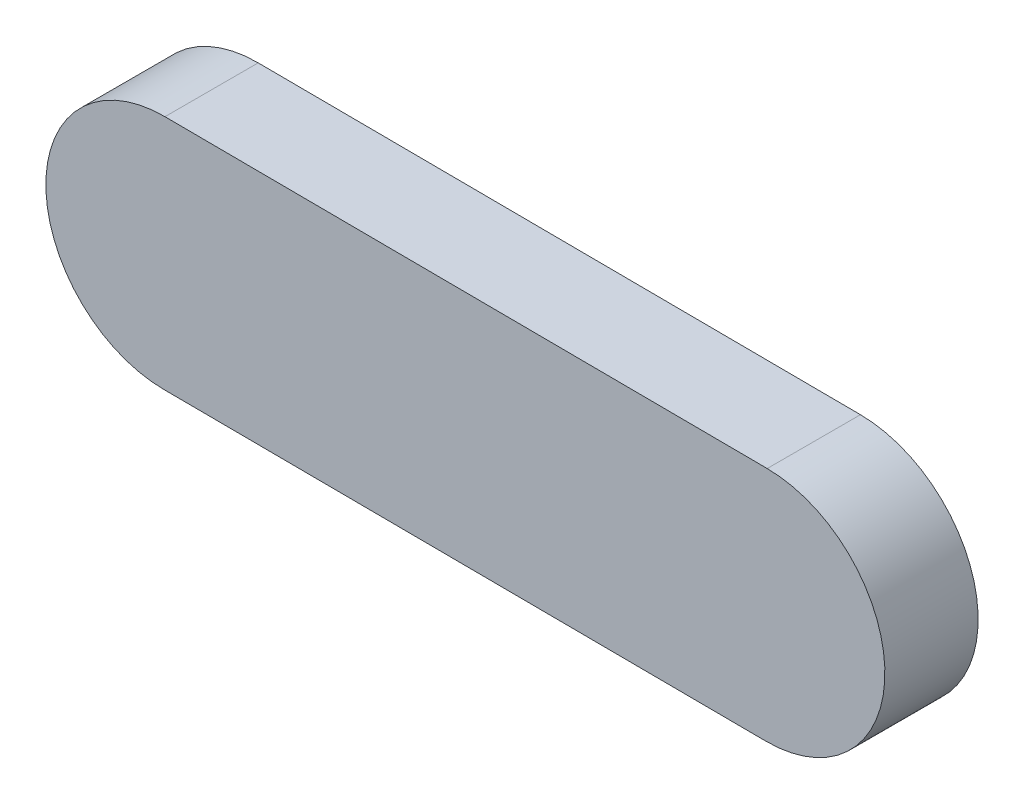
ISO-10303-21;
HEADER;
FILE_DESCRIPTION(('STEP AP214'),'2;1');
FILE_NAME('part.step','',(''),(''),'','','');
FILE_SCHEMA(('AUTOMOTIVE_DESIGN { 1 0 10303 214 1 1 1 1 }'));
ENDSEC;
DATA;
#1=APPLICATION_CONTEXT('core data for automotive mechanical design processes');
#2=APPLICATION_PROTOCOL_DEFINITION('international standard','automotive_design',2000,#1);
#3=PRODUCT_CONTEXT('',#1,'mechanical');
#4=PRODUCT('Part','Part','',(#3));
#5=PRODUCT_RELATED_PRODUCT_CATEGORY('part','',(#4));
#6=PRODUCT_DEFINITION_FORMATION('','',#4);
#7=PRODUCT_DEFINITION_CONTEXT('part definition',#1,'design');
#8=PRODUCT_DEFINITION('design','',#6,#7);
#9=PRODUCT_DEFINITION_SHAPE('','',#8);
#10=(LENGTH_UNIT() NAMED_UNIT(*) SI_UNIT(.MILLI.,.METRE.));
#11=(NAMED_UNIT(*) PLANE_ANGLE_UNIT() SI_UNIT($,.RADIAN.));
#12=(NAMED_UNIT(*) SI_UNIT($,.STERADIAN.) SOLID_ANGLE_UNIT());
#13=UNCERTAINTY_MEASURE_WITH_UNIT(LENGTH_MEASURE(1.E-05),#10,'distance_accuracy_value','');
#14=(GEOMETRIC_REPRESENTATION_CONTEXT(3) GLOBAL_UNCERTAINTY_ASSIGNED_CONTEXT((#13)) GLOBAL_UNIT_ASSIGNED_CONTEXT((#10,
#11,#12)) REPRESENTATION_CONTEXT('',''));
#15=CARTESIAN_POINT('',(0.,0.,0.));
#16=DIRECTION('',(0.,0.,1.));
#17=DIRECTION('',(1.,0.,0.));
#18=AXIS2_PLACEMENT_3D('',#15,#16,#17);
#19=CARTESIAN_POINT('',(92.79912352,53.77949874,0.));
#20=DIRECTION('',(0.0059531297615283,0.999982279966022,0.));
#21=DIRECTION('',(0.999982279966022,-0.0059531297615283,0.));
#22=AXIS2_PLACEMENT_3D('',#19,#20,#21);
#23=PLANE('',#22);
#24=DIRECTION('',(0.999982279966022,-0.0059531297615283,0.));
#25=VECTOR('',#24,1.);
#26=CARTESIAN_POINT('',(92.79912352,53.77949874,0.1999996));
#27=LINE('',#26,#25);
#28=CARTESIAN_POINT('',(92.79912352,53.77949874,0.1999996));
#29=VERTEX_POINT('',#28);
#30=CARTESIAN_POINT('',(94.09104626,53.77180762,0.1999996));
#31=VERTEX_POINT('',#30);
#32=EDGE_CURVE('E11',#29,#31,#27,.T.);
#33=ORIENTED_EDGE('',*,*,#32,.F.);
#34=DIRECTION('',(0.,0.,1.));
#35=VECTOR('',#34,1.);
#36=CARTESIAN_POINT('',(92.79912352,53.77949874,0.));
#37=LINE('',#36,#35);
#38=CARTESIAN_POINT('',(92.79912352,53.77949874,0.));
#39=VERTEX_POINT('',#38);
#40=EDGE_CURVE('E24',#39,#29,#37,.T.);
#41=ORIENTED_EDGE('',*,*,#40,.F.);
#42=DIRECTION('',(0.999982279966022,-0.0059531297615283,0.));
#43=VECTOR('',#42,1.);
#44=CARTESIAN_POINT('',(92.79912352,53.77949874,0.));
#45=LINE('',#44,#43);
#46=CARTESIAN_POINT('',(94.09104626,53.77180762,0.));
#47=VERTEX_POINT('',#46);
#48=EDGE_CURVE('E75',#39,#47,#45,.T.);
#49=ORIENTED_EDGE('',*,*,#48,.T.);
#50=DIRECTION('',(0.,0.,1.));
#51=VECTOR('',#50,1.);
#52=CARTESIAN_POINT('',(94.09104626,53.77180762,0.));
#53=LINE('',#52,#51);
#54=EDGE_CURVE('E37',#47,#31,#53,.T.);
#55=ORIENTED_EDGE('',*,*,#54,.T.);
#56=EDGE_LOOP('',(#33,#41,#49,#55));
#57=FACE_BOUND('',#56,.T.);
#58=ADVANCED_FACE('F17',(#57),#23,.F.);
#59=CARTESIAN_POINT('',(94.0925600923923,54.0258025324823,0.));
#60=DIRECTION('',(0.,0.,-1.));
#61=DIRECTION('',(-0.00595998357032471,-0.999982239140197,0.));
#62=AXIS2_PLACEMENT_3D('',#59,#60,#61);
#63=CYLINDRICAL_SURFACE('',#62,0.253999423730456);
#64=CARTESIAN_POINT('',(94.0925600923923,54.0258025324823,0.1999996));
#65=DIRECTION('',(0.,0.,1.));
#66=DIRECTION('',(-0.00595998357032471,-0.999982239140197,0.));
#67=AXIS2_PLACEMENT_3D('',#64,#65,#66);
#68=CIRCLE('',#67,0.253999423730456);
#69=CARTESIAN_POINT('',(94.0940714,54.27979746,0.1999996));
#70=VERTEX_POINT('',#69);
#71=EDGE_CURVE('E83',#31,#70,#68,.T.);
#72=ORIENTED_EDGE('',*,*,#71,.F.);
#73=ORIENTED_EDGE('',*,*,#54,.F.);
#74=CARTESIAN_POINT('',(94.0925600923923,54.0258025324823,0.));
#75=DIRECTION('',(0.,0.,1.));
#76=DIRECTION('',(-0.00595998357032471,-0.999982239140197,0.));
#77=AXIS2_PLACEMENT_3D('',#74,#75,#76);
#78=CIRCLE('',#77,0.253999423730456);
#79=CARTESIAN_POINT('',(94.0940714,54.27979746,0.));
#80=VERTEX_POINT('',#79);
#81=EDGE_CURVE('E81',#47,#80,#78,.T.);
#82=ORIENTED_EDGE('',*,*,#81,.T.);
#83=DIRECTION('',(0.,0.,1.));
#84=VECTOR('',#83,1.);
#85=CARTESIAN_POINT('',(94.0940714,54.27979746,0.));
#86=LINE('',#85,#84);
#87=EDGE_CURVE('E67',#80,#70,#86,.T.);
#88=ORIENTED_EDGE('',*,*,#87,.T.);
#89=EDGE_LOOP('',(#72,#73,#82,#88));
#90=FACE_BOUND('',#89,.T.);
#91=ADVANCED_FACE('F89',(#90),#63,.T.);
#92=CARTESIAN_POINT('',(94.0940714,54.27979746,0.));
#93=DIRECTION('',(-0.00595312976152836,-0.999982279966022,0.));
#94=DIRECTION('',(-0.999982279966022,0.00595312976152836,0.));
#95=AXIS2_PLACEMENT_3D('',#92,#93,#94);
#96=PLANE('',#95);
#97=DIRECTION('',(-0.999982279966022,0.00595312976152836,0.));
#98=VECTOR('',#97,1.);
#99=CARTESIAN_POINT('',(94.0940714,54.27979746,0.1999996));
#100=LINE('',#99,#98);
#101=CARTESIAN_POINT('',(92.80214866,54.28748858,0.1999996));
#102=VERTEX_POINT('',#101);
#103=EDGE_CURVE('E71',#70,#102,#100,.T.);
#104=ORIENTED_EDGE('',*,*,#103,.F.);
#105=ORIENTED_EDGE('',*,*,#87,.F.);
#106=DIRECTION('',(-0.999982279966022,0.00595312976152836,0.));
#107=VECTOR('',#106,1.);
#108=CARTESIAN_POINT('',(94.0940714,54.27979746,0.));
#109=LINE('',#108,#107);
#110=CARTESIAN_POINT('',(92.80214866,54.28748858,0.));
#111=VERTEX_POINT('',#110);
#112=EDGE_CURVE('E63',#80,#111,#109,.T.);
#113=ORIENTED_EDGE('',*,*,#112,.T.);
#114=DIRECTION('',(0.,0.,1.));
#115=VECTOR('',#114,1.);
#116=CARTESIAN_POINT('',(92.80214866,54.28748858,0.));
#117=LINE('',#116,#115);
#118=EDGE_CURVE('E53',#111,#102,#117,.T.);
#119=ORIENTED_EDGE('',*,*,#118,.T.);
#120=EDGE_LOOP('',(#104,#105,#113,#119));
#121=FACE_BOUND('',#120,.T.);
#122=ADVANCED_FACE('F66',(#121),#96,.F.);
#123=CARTESIAN_POINT('',(92.8006348276077,54.0334936675177,0.));
#124=DIRECTION('',(0.,0.,-1.));
#125=DIRECTION('',(0.00595998357032454,0.999982239140197,0.));
#126=AXIS2_PLACEMENT_3D('',#123,#124,#125);
#127=CYLINDRICAL_SURFACE('',#126,0.253999423730456);
#128=CARTESIAN_POINT('',(92.8006348276077,54.0334936675177,0.1999996));
#129=DIRECTION('',(0.,0.,1.));
#130=DIRECTION('',(0.00595998357032454,0.999982239140197,0.));
#131=AXIS2_PLACEMENT_3D('',#128,#129,#130);
#132=CIRCLE('',#131,0.253999423730456);
#133=EDGE_CURVE('E59',#102,#29,#132,.T.);
#134=ORIENTED_EDGE('',*,*,#133,.F.);
#135=ORIENTED_EDGE('',*,*,#118,.F.);
#136=CARTESIAN_POINT('',(92.8006348276077,54.0334936675177,0.));
#137=DIRECTION('',(0.,0.,1.));
#138=DIRECTION('',(0.00595998357032454,0.999982239140197,0.));
#139=AXIS2_PLACEMENT_3D('',#136,#137,#138);
#140=CIRCLE('',#139,0.253999423730456);
#141=EDGE_CURVE('E57',#111,#39,#140,.T.);
#142=ORIENTED_EDGE('',*,*,#141,.T.);
#143=ORIENTED_EDGE('',*,*,#40,.T.);
#144=EDGE_LOOP('',(#134,#135,#142,#143));
#145=FACE_BOUND('',#144,.T.);
#146=ADVANCED_FACE('F55',(#145),#127,.T.);
#147=CARTESIAN_POINT('',(92.79912352,53.77949874,0.));
#148=DIRECTION('',(0.,0.,-1.));
#149=DIRECTION('',(-1.,0.,0.));
#150=AXIS2_PLACEMENT_3D('',#147,#148,#149);
#151=PLANE('',#150);
#152=ORIENTED_EDGE('',*,*,#141,.F.);
#153=ORIENTED_EDGE('',*,*,#112,.F.);
#154=ORIENTED_EDGE('',*,*,#81,.F.);
#155=ORIENTED_EDGE('',*,*,#48,.F.);
#156=EDGE_LOOP('',(#152,#153,#154,#155));
#157=FACE_BOUND('',#156,.T.);
#158=ADVANCED_FACE('F74',(#157),#151,.T.);
#159=CARTESIAN_POINT('',(92.79912352,53.77949874,0.1999996));
#160=DIRECTION('',(0.,0.,-1.));
#161=DIRECTION('',(-1.,0.,0.));
#162=AXIS2_PLACEMENT_3D('',#159,#160,#161);
#163=PLANE('',#162);
#164=ORIENTED_EDGE('',*,*,#32,.T.);
#165=ORIENTED_EDGE('',*,*,#71,.T.);
#166=ORIENTED_EDGE('',*,*,#103,.T.);
#167=ORIENTED_EDGE('',*,*,#133,.T.);
#168=EDGE_LOOP('',(#164,#165,#166,#167));
#169=FACE_BOUND('',#168,.T.);
#170=ADVANCED_FACE('F91',(#169),#163,.F.);
#171=CLOSED_SHELL('',(#58,#91,#122,#146,#158,#170));
#172=MANIFOLD_SOLID_BREP('B1',#171);
#173=ADVANCED_BREP_SHAPE_REPRESENTATION('',(#18,#172),#14);
#174=SHAPE_DEFINITION_REPRESENTATION(#9,#173);
ENDSEC;
END-ISO-10303-21;
